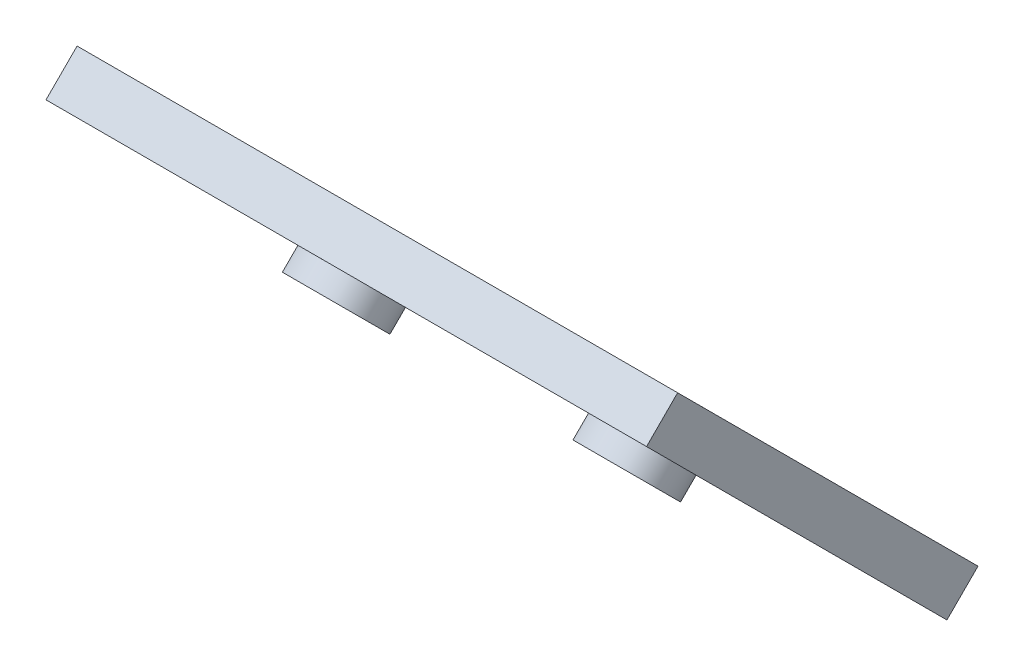
ISO-10303-21;
HEADER;
FILE_DESCRIPTION(('STEP AP214'),'2;1');
FILE_NAME('part.step','',(''),(''),'','','');
FILE_SCHEMA(('AUTOMOTIVE_DESIGN { 1 0 10303 214 1 1 1 1 }'));
ENDSEC;
DATA;
#1=APPLICATION_CONTEXT('core data for automotive mechanical design processes');
#2=APPLICATION_PROTOCOL_DEFINITION('international standard','automotive_design',2000,#1);
#3=PRODUCT_CONTEXT('',#1,'mechanical');
#4=PRODUCT('Part','Part','',(#3));
#5=PRODUCT_RELATED_PRODUCT_CATEGORY('part','',(#4));
#6=PRODUCT_DEFINITION_FORMATION('','',#4);
#7=PRODUCT_DEFINITION_CONTEXT('part definition',#1,'design');
#8=PRODUCT_DEFINITION('design','',#6,#7);
#9=PRODUCT_DEFINITION_SHAPE('','',#8);
#10=(LENGTH_UNIT() NAMED_UNIT(*) SI_UNIT(.MILLI.,.METRE.));
#11=(NAMED_UNIT(*) PLANE_ANGLE_UNIT() SI_UNIT($,.RADIAN.));
#12=(NAMED_UNIT(*) SI_UNIT($,.STERADIAN.) SOLID_ANGLE_UNIT());
#13=UNCERTAINTY_MEASURE_WITH_UNIT(LENGTH_MEASURE(1.E-05),#10,'distance_accuracy_value','');
#14=(GEOMETRIC_REPRESENTATION_CONTEXT(3) GLOBAL_UNCERTAINTY_ASSIGNED_CONTEXT((#13)) GLOBAL_UNIT_ASSIGNED_CONTEXT((#10,
#11,#12)) REPRESENTATION_CONTEXT('',''));
#15=CARTESIAN_POINT('',(0.,0.,0.));
#16=DIRECTION('',(0.,0.,1.));
#17=DIRECTION('',(1.,0.,0.));
#18=AXIS2_PLACEMENT_3D('',#15,#16,#17);
#19=CARTESIAN_POINT('',(48.7956932814946,10.222718241315,13.0333784130949));
#20=DIRECTION('',(-1.,0.,0.));
#21=DIRECTION('',(0.,-0.707106781186548,0.707106781186547));
#22=AXIS2_PLACEMENT_3D('',#19,#20,#21);
#23=PLANE('',#22);
#24=DIRECTION('',(0.,0.707106781186547,0.707106781186548));
#25=VECTOR('',#24,1.);
#26=CARTESIAN_POINT('',(48.7956932814946,12.3440385848747,10.9120580695352));
#27=LINE('',#26,#25);
#28=CARTESIAN_POINT('',(48.7956932814946,-8.1620580695352,-9.59403858487468));
#29=VERTEX_POINT('',#28);
#30=CARTESIAN_POINT('',(48.7956932814946,12.3440385848747,10.9120580695352));
#31=VERTEX_POINT('',#30);
#32=EDGE_CURVE('E95',#29,#31,#27,.T.);
#33=ORIENTED_EDGE('',*,*,#32,.T.);
#34=DIRECTION('',(0.,0.707106781186548,-0.707106781186547));
#35=VECTOR('',#34,1.);
#36=CARTESIAN_POINT('',(48.7956932814946,10.222718241315,13.0333784130949));
#37=LINE('',#36,#35);
#38=CARTESIAN_POINT('',(48.7956932814946,10.222718241315,13.0333784130949));
#39=VERTEX_POINT('',#38);
#40=EDGE_CURVE('E11',#39,#31,#37,.T.);
#41=ORIENTED_EDGE('',*,*,#40,.F.);
#42=DIRECTION('',(0.,0.707106781186547,0.707106781186548));
#43=VECTOR('',#42,1.);
#44=CARTESIAN_POINT('',(48.7956932814946,10.222718241315,13.0333784130949));
#45=LINE('',#44,#43);
#46=CARTESIAN_POINT('',(48.7956932814946,-10.2833784130948,-7.47271824131504));
#47=VERTEX_POINT('',#46);
#48=EDGE_CURVE('E83',#47,#39,#45,.T.);
#49=ORIENTED_EDGE('',*,*,#48,.F.);
#50=DIRECTION('',(0.,0.707106781186548,-0.707106781186547));
#51=VECTOR('',#50,1.);
#52=CARTESIAN_POINT('',(48.7956932814946,-10.2833784130948,-7.47271824131504));
#53=LINE('',#52,#51);
#54=EDGE_CURVE('E91',#47,#29,#53,.T.);
#55=ORIENTED_EDGE('',*,*,#54,.T.);
#56=EDGE_LOOP('',(#33,#41,#49,#55));
#57=FACE_BOUND('',#56,.T.);
#58=ADVANCED_FACE('F32',(#57),#23,.F.);
#59=CARTESIAN_POINT('',(7.79569328149461,10.222718241315,13.0333784130949));
#60=DIRECTION('',(0.,-0.707106781186547,-0.707106781186548));
#61=DIRECTION('',(0.,0.707106781186548,-0.707106781186547));
#62=AXIS2_PLACEMENT_3D('',#59,#60,#61);
#63=PLANE('',#62);
#64=DIRECTION('',(-1.,0.,0.));
#65=VECTOR('',#64,1.);
#66=CARTESIAN_POINT('',(7.79569328149461,12.3440385848747,10.9120580695352));
#67=LINE('',#66,#65);
#68=CARTESIAN_POINT('',(7.79569328149461,12.3440385848747,10.9120580695352));
#69=VERTEX_POINT('',#68);
#70=EDGE_CURVE('E87',#31,#69,#67,.T.);
#71=ORIENTED_EDGE('',*,*,#70,.T.);
#72=DIRECTION('',(0.,0.707106781186548,-0.707106781186547));
#73=VECTOR('',#72,1.);
#74=CARTESIAN_POINT('',(7.79569328149461,10.222718241315,13.0333784130949));
#75=LINE('',#74,#73);
#76=CARTESIAN_POINT('',(7.79569328149461,10.222718241315,13.0333784130949));
#77=VERTEX_POINT('',#76);
#78=EDGE_CURVE('E40',#77,#69,#75,.T.);
#79=ORIENTED_EDGE('',*,*,#78,.F.);
#80=DIRECTION('',(-1.,0.,0.));
#81=VECTOR('',#80,1.);
#82=CARTESIAN_POINT('',(7.79569328149461,10.222718241315,13.0333784130949));
#83=LINE('',#82,#81);
#84=EDGE_CURVE('E78',#39,#77,#83,.T.);
#85=ORIENTED_EDGE('',*,*,#84,.F.);
#86=ORIENTED_EDGE('',*,*,#40,.T.);
#87=EDGE_LOOP('',(#71,#79,#85,#86));
#88=FACE_BOUND('',#87,.T.);
#89=ADVANCED_FACE('F86',(#88),#63,.F.);
#90=CARTESIAN_POINT('',(7.79569328149461,10.222718241315,13.0333784130949));
#91=DIRECTION('',(1.,0.,0.));
#92=DIRECTION('',(0.,0.707106781186547,0.707106781186548));
#93=AXIS2_PLACEMENT_3D('',#90,#91,#92);
#94=PLANE('',#93);
#95=DIRECTION('',(0.,-0.707106781186547,-0.707106781186548));
#96=VECTOR('',#95,1.);
#97=CARTESIAN_POINT('',(7.79569328149461,12.3440385848747,10.9120580695352));
#98=LINE('',#97,#96);
#99=CARTESIAN_POINT('',(7.79569328149461,-8.1620580695352,-9.59403858487468));
#100=VERTEX_POINT('',#99);
#101=EDGE_CURVE('E65',#69,#100,#98,.T.);
#102=ORIENTED_EDGE('',*,*,#101,.T.);
#103=DIRECTION('',(0.,0.707106781186548,-0.707106781186547));
#104=VECTOR('',#103,1.);
#105=CARTESIAN_POINT('',(7.79569328149461,-10.2833784130948,-7.47271824131504));
#106=LINE('',#105,#104);
#107=CARTESIAN_POINT('',(7.79569328149461,-10.2833784130948,-7.47271824131504));
#108=VERTEX_POINT('',#107);
#109=EDGE_CURVE('E88',#108,#100,#106,.T.);
#110=ORIENTED_EDGE('',*,*,#109,.F.);
#111=DIRECTION('',(0.,-0.707106781186547,-0.707106781186548));
#112=VECTOR('',#111,1.);
#113=CARTESIAN_POINT('',(7.79569328149461,10.222718241315,13.0333784130949));
#114=LINE('',#113,#112);
#115=EDGE_CURVE('E81',#77,#108,#114,.T.);
#116=ORIENTED_EDGE('',*,*,#115,.F.);
#117=ORIENTED_EDGE('',*,*,#78,.T.);
#118=EDGE_LOOP('',(#102,#110,#116,#117));
#119=FACE_BOUND('',#118,.T.);
#120=ADVANCED_FACE('F89',(#119),#94,.F.);
#121=CARTESIAN_POINT('',(7.79569328149461,-10.2833784130948,-7.47271824131504));
#122=DIRECTION('',(0.,0.707106781186547,0.707106781186548));
#123=DIRECTION('',(0.,-0.707106781186548,0.707106781186547));
#124=AXIS2_PLACEMENT_3D('',#121,#122,#123);
#125=PLANE('',#124);
#126=DIRECTION('',(1.,0.,0.));
#127=VECTOR('',#126,1.);
#128=CARTESIAN_POINT('',(7.79569328149461,-8.1620580695352,-9.59403858487468));
#129=LINE('',#128,#127);
#130=EDGE_CURVE('E71',#100,#29,#129,.T.);
#131=ORIENTED_EDGE('',*,*,#130,.T.);
#132=ORIENTED_EDGE('',*,*,#54,.F.);
#133=DIRECTION('',(1.,0.,0.));
#134=VECTOR('',#133,1.);
#135=CARTESIAN_POINT('',(7.79569328149461,-10.2833784130948,-7.47271824131504));
#136=LINE('',#135,#134);
#137=EDGE_CURVE('E48',#108,#47,#136,.T.);
#138=ORIENTED_EDGE('',*,*,#137,.F.);
#139=ORIENTED_EDGE('',*,*,#109,.T.);
#140=EDGE_LOOP('',(#131,#132,#138,#139));
#141=FACE_BOUND('',#140,.T.);
#142=ADVANCED_FACE('F103',(#141),#125,.F.);
#143=CARTESIAN_POINT('',(28.2956932814946,-0.0303300858899081,2.7803300858899));
#144=DIRECTION('',(0.,-0.707106781186548,0.707106781186547));
#145=DIRECTION('',(1.,0.,0.));
#146=AXIS2_PLACEMENT_3D('',#143,#144,#145);
#147=PLANE('',#146);
#148=CARTESIAN_POINT('',(38.2486319289889,-0.030330085889904,2.78033008588991));
#149=DIRECTION('',(0.,-0.707106781186548,0.707106781186547));
#150=DIRECTION('',(1.,0.,0.));
#151=AXIS2_PLACEMENT_3D('',#148,#149,#150);
#152=CIRCLE('',#151,3.);
#153=CARTESIAN_POINT('',(41.2486319289889,-0.030330085889904,2.78033008588991));
#154=VERTEX_POINT('',#153);
#155=EDGE_CURVE('E115',#154,#154,#152,.T.);
#156=ORIENTED_EDGE('',*,*,#155,.F.);
#157=EDGE_LOOP('',(#156));
#158=FACE_BOUND('',#157,.T.);
#159=CARTESIAN_POINT('',(18.4084488898902,-0.030330085889904,2.78033008588991));
#160=DIRECTION('',(0.,-0.707106781186548,0.707106781186547));
#161=DIRECTION('',(1.,0.,0.));
#162=AXIS2_PLACEMENT_3D('',#159,#160,#161);
#163=CIRCLE('',#162,3.);
#164=CARTESIAN_POINT('',(21.4084488898902,-0.030330085889904,2.78033008588991));
#165=VERTEX_POINT('',#164);
#166=EDGE_CURVE('E109',#165,#165,#163,.T.);
#167=ORIENTED_EDGE('',*,*,#166,.F.);
#168=EDGE_LOOP('',(#167));
#169=FACE_BOUND('',#168,.T.);
#170=ORIENTED_EDGE('',*,*,#48,.T.);
#171=ORIENTED_EDGE('',*,*,#84,.T.);
#172=ORIENTED_EDGE('',*,*,#115,.T.);
#173=ORIENTED_EDGE('',*,*,#137,.T.);
#174=EDGE_LOOP('',(#170,#171,#172,#173));
#175=FACE_BOUND('',#174,.T.);
#176=ADVANCED_FACE('F79',(#158,#169,#175),#147,.T.);
#177=CARTESIAN_POINT('',(28.2956932814946,2.09099025766974,0.659009742330263));
#178=DIRECTION('',(0.,-0.707106781186548,0.707106781186547));
#179=DIRECTION('',(1.,0.,0.));
#180=AXIS2_PLACEMENT_3D('',#177,#178,#179);
#181=PLANE('',#180);
#182=CARTESIAN_POINT('',(18.4084488898902,2.09099025766974,0.659009742330267));
#183=DIRECTION('',(0.,-0.707106781186548,0.707106781186547));
#184=DIRECTION('',(1.,0.,0.));
#185=AXIS2_PLACEMENT_3D('',#182,#183,#184);
#186=CIRCLE('',#185,2.);
#187=CARTESIAN_POINT('',(20.4084488898902,2.09099025766974,0.659009742330267));
#188=VERTEX_POINT('',#187);
#189=EDGE_CURVE('E126',#188,#188,#186,.T.);
#190=ORIENTED_EDGE('',*,*,#189,.T.);
#191=EDGE_LOOP('',(#190));
#192=FACE_BOUND('',#191,.T.);
#193=CARTESIAN_POINT('',(38.2486319289889,2.09099025766974,0.659009742330267));
#194=DIRECTION('',(0.,-0.707106781186548,0.707106781186547));
#195=DIRECTION('',(1.,0.,0.));
#196=AXIS2_PLACEMENT_3D('',#193,#194,#195);
#197=CIRCLE('',#196,2.);
#198=CARTESIAN_POINT('',(40.2486319289889,2.09099025766974,0.659009742330267));
#199=VERTEX_POINT('',#198);
#200=EDGE_CURVE('E118',#199,#199,#197,.T.);
#201=ORIENTED_EDGE('',*,*,#200,.T.);
#202=EDGE_LOOP('',(#201));
#203=FACE_BOUND('',#202,.T.);
#204=ORIENTED_EDGE('',*,*,#32,.F.);
#205=ORIENTED_EDGE('',*,*,#130,.F.);
#206=ORIENTED_EDGE('',*,*,#101,.F.);
#207=ORIENTED_EDGE('',*,*,#70,.F.);
#208=EDGE_LOOP('',(#204,#205,#206,#207));
#209=FACE_BOUND('',#208,.T.);
#210=ADVANCED_FACE('F106',(#192,#203,#209),#181,.F.);
#211=CARTESIAN_POINT('',(18.4084488898902,-1.09099025766973,3.84099025766973));
#212=DIRECTION('',(0.,0.707106781186548,-0.707106781186547));
#213=DIRECTION('',(-1.,0.,0.));
#214=AXIS2_PLACEMENT_3D('',#211,#212,#213);
#215=CYLINDRICAL_SURFACE('',#214,3.);
#216=CARTESIAN_POINT('',(18.4084488898902,-1.09099025766973,3.84099025766973));
#217=DIRECTION('',(0.,-0.707106781186548,0.707106781186547));
#218=DIRECTION('',(1.,0.,0.));
#219=AXIS2_PLACEMENT_3D('',#216,#217,#218);
#220=CIRCLE('',#219,3.);
#221=CARTESIAN_POINT('',(21.4084488898902,-1.09099025766973,3.84099025766973));
#222=VERTEX_POINT('',#221);
#223=EDGE_CURVE('E98',#222,#222,#220,.T.);
#224=ORIENTED_EDGE('',*,*,#223,.F.);
#225=EDGE_LOOP('',(#224));
#226=FACE_BOUND('',#225,.T.);
#227=ORIENTED_EDGE('',*,*,#166,.T.);
#228=EDGE_LOOP('',(#227));
#229=FACE_BOUND('',#228,.T.);
#230=ADVANCED_FACE('F139',(#226,#229),#215,.T.);
#231=CARTESIAN_POINT('',(18.4084488898902,-1.09099025766973,3.84099025766973));
#232=DIRECTION('',(0.,-0.707106781186548,0.707106781186547));
#233=DIRECTION('',(1.,0.,0.));
#234=AXIS2_PLACEMENT_3D('',#231,#232,#233);
#235=PLANE('',#234);
#236=CARTESIAN_POINT('',(18.4084488898902,-1.09099025766973,3.84099025766973));
#237=DIRECTION('',(0.,-0.707106781186548,0.707106781186547));
#238=DIRECTION('',(1.,0.,0.));
#239=AXIS2_PLACEMENT_3D('',#236,#237,#238);
#240=CIRCLE('',#239,2.);
#241=CARTESIAN_POINT('',(20.4084488898902,-1.09099025766973,3.84099025766973));
#242=VERTEX_POINT('',#241);
#243=EDGE_CURVE('E129',#242,#242,#240,.T.);
#244=ORIENTED_EDGE('',*,*,#243,.F.);
#245=EDGE_LOOP('',(#244));
#246=FACE_BOUND('',#245,.T.);
#247=ORIENTED_EDGE('',*,*,#223,.T.);
#248=EDGE_LOOP('',(#247));
#249=FACE_BOUND('',#248,.T.);
#250=ADVANCED_FACE('F135',(#246,#249),#235,.T.);
#251=CARTESIAN_POINT('',(38.2486319289889,-1.09099025766973,3.84099025766973));
#252=DIRECTION('',(0.,0.707106781186548,-0.707106781186547));
#253=DIRECTION('',(-1.,0.,0.));
#254=AXIS2_PLACEMENT_3D('',#251,#252,#253);
#255=CYLINDRICAL_SURFACE('',#254,3.);
#256=CARTESIAN_POINT('',(38.2486319289889,-1.09099025766973,3.84099025766973));
#257=DIRECTION('',(0.,-0.707106781186548,0.707106781186547));
#258=DIRECTION('',(1.,0.,0.));
#259=AXIS2_PLACEMENT_3D('',#256,#257,#258);
#260=CIRCLE('',#259,3.);
#261=CARTESIAN_POINT('',(41.2486319289889,-1.09099025766973,3.84099025766973));
#262=VERTEX_POINT('',#261);
#263=EDGE_CURVE('E112',#262,#262,#260,.T.);
#264=ORIENTED_EDGE('',*,*,#263,.F.);
#265=EDGE_LOOP('',(#264));
#266=FACE_BOUND('',#265,.T.);
#267=ORIENTED_EDGE('',*,*,#155,.T.);
#268=EDGE_LOOP('',(#267));
#269=FACE_BOUND('',#268,.T.);
#270=ADVANCED_FACE('F138',(#266,#269),#255,.T.);
#271=CARTESIAN_POINT('',(38.2486319289889,-1.09099025766973,3.84099025766973));
#272=DIRECTION('',(0.,-0.707106781186548,0.707106781186547));
#273=DIRECTION('',(1.,0.,0.));
#274=AXIS2_PLACEMENT_3D('',#271,#272,#273);
#275=PLANE('',#274);
#276=CARTESIAN_POINT('',(38.2486319289889,-1.09099025766973,3.84099025766973));
#277=DIRECTION('',(0.,-0.707106781186548,0.707106781186547));
#278=DIRECTION('',(1.,0.,0.));
#279=AXIS2_PLACEMENT_3D('',#276,#277,#278);
#280=CIRCLE('',#279,2.);
#281=CARTESIAN_POINT('',(40.2486319289889,-1.09099025766973,3.84099025766973));
#282=VERTEX_POINT('',#281);
#283=EDGE_CURVE('E123',#282,#282,#280,.T.);
#284=ORIENTED_EDGE('',*,*,#283,.F.);
#285=EDGE_LOOP('',(#284));
#286=FACE_BOUND('',#285,.T.);
#287=ORIENTED_EDGE('',*,*,#263,.T.);
#288=EDGE_LOOP('',(#287));
#289=FACE_BOUND('',#288,.T.);
#290=ADVANCED_FACE('F214',(#286,#289),#275,.T.);
#291=CARTESIAN_POINT('',(38.2486319289889,-1.09099025766973,3.84099025766973));
#292=DIRECTION('',(0.,-0.707106781186548,0.707106781186547));
#293=DIRECTION('',(1.,0.,0.));
#294=AXIS2_PLACEMENT_3D('',#291,#292,#293);
#295=CYLINDRICAL_SURFACE('',#294,2.);
#296=ORIENTED_EDGE('',*,*,#200,.F.);
#297=EDGE_LOOP('',(#296));
#298=FACE_BOUND('',#297,.T.);
#299=ORIENTED_EDGE('',*,*,#283,.T.);
#300=EDGE_LOOP('',(#299));
#301=FACE_BOUND('',#300,.T.);
#302=ADVANCED_FACE('F222',(#298,#301),#295,.F.);
#303=CARTESIAN_POINT('',(18.4084488898902,-1.09099025766973,3.84099025766973));
#304=DIRECTION('',(0.,-0.707106781186548,0.707106781186547));
#305=DIRECTION('',(1.,0.,0.));
#306=AXIS2_PLACEMENT_3D('',#303,#304,#305);
#307=CYLINDRICAL_SURFACE('',#306,2.);
#308=ORIENTED_EDGE('',*,*,#189,.F.);
#309=EDGE_LOOP('',(#308));
#310=FACE_BOUND('',#309,.T.);
#311=ORIENTED_EDGE('',*,*,#243,.T.);
#312=EDGE_LOOP('',(#311));
#313=FACE_BOUND('',#312,.T.);
#314=ADVANCED_FACE('F133',(#310,#313),#307,.F.);
#315=CLOSED_SHELL('',(#58,#89,#120,#142,#176,#210,#230,#250,#270,#290,#302,#314));
#316=MANIFOLD_SOLID_BREP('B2',#315);
#317=ADVANCED_BREP_SHAPE_REPRESENTATION('',(#18,#316),#14);
#318=SHAPE_DEFINITION_REPRESENTATION(#9,#317);
ENDSEC;
END-ISO-10303-21;
